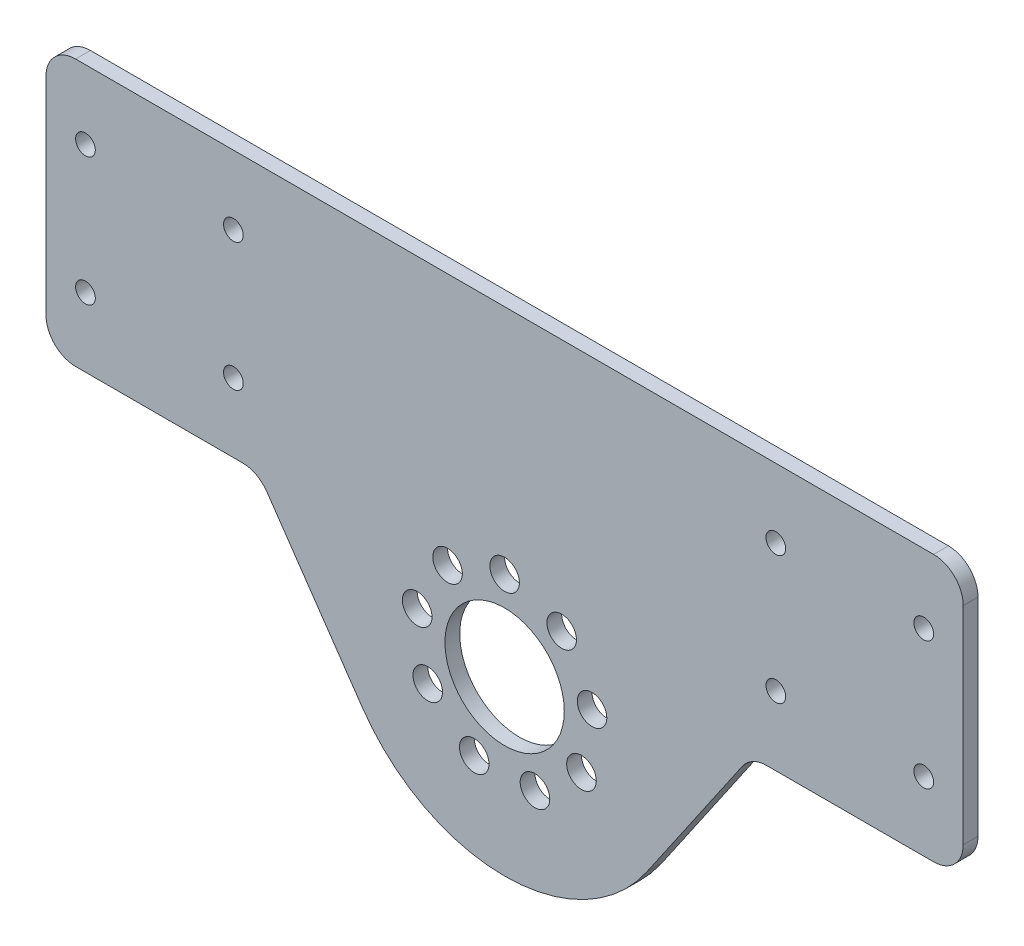
ISO-10303-21;
HEADER;
FILE_DESCRIPTION(('STEP AP214'),'2;1');
FILE_NAME('part.step','',(''),(''),'','','');
FILE_SCHEMA(('AUTOMOTIVE_DESIGN { 1 0 10303 214 1 1 1 1 }'));
ENDSEC;
DATA;
#1=APPLICATION_CONTEXT('core data for automotive mechanical design processes');
#2=APPLICATION_PROTOCOL_DEFINITION('international standard','automotive_design',2000,#1);
#3=PRODUCT_CONTEXT('',#1,'mechanical');
#4=PRODUCT('Part','Part','',(#3));
#5=PRODUCT_RELATED_PRODUCT_CATEGORY('part','',(#4));
#6=PRODUCT_DEFINITION_FORMATION('','',#4);
#7=PRODUCT_DEFINITION_CONTEXT('part definition',#1,'design');
#8=PRODUCT_DEFINITION('design','',#6,#7);
#9=PRODUCT_DEFINITION_SHAPE('','',#8);
#10=(LENGTH_UNIT() NAMED_UNIT(*) SI_UNIT(.MILLI.,.METRE.));
#11=(NAMED_UNIT(*) PLANE_ANGLE_UNIT() SI_UNIT($,.RADIAN.));
#12=(NAMED_UNIT(*) SI_UNIT($,.STERADIAN.) SOLID_ANGLE_UNIT());
#13=UNCERTAINTY_MEASURE_WITH_UNIT(LENGTH_MEASURE(1.E-05),#10,'distance_accuracy_value','');
#14=(GEOMETRIC_REPRESENTATION_CONTEXT(3) GLOBAL_UNCERTAINTY_ASSIGNED_CONTEXT((#13)) GLOBAL_UNIT_ASSIGNED_CONTEXT((#10,
#11,#12)) REPRESENTATION_CONTEXT('',''));
#15=CARTESIAN_POINT('',(0.,0.,0.));
#16=DIRECTION('',(0.,0.,1.));
#17=DIRECTION('',(1.,0.,0.));
#18=AXIS2_PLACEMENT_3D('',#15,#16,#17);
#19=CARTESIAN_POINT('',(-46.5,-27.,1.5));
#20=DIRECTION('',(0.,1.,0.));
#21=DIRECTION('',(-1.,0.,0.));
#22=AXIS2_PLACEMENT_3D('',#19,#20,#21);
#23=PLANE('',#22);
#24=DIRECTION('',(1.,0.,0.));
#25=VECTOR('',#24,1.);
#26=CARTESIAN_POINT('',(-46.5,-27.,1.5));
#27=LINE('',#26,#25);
#28=CARTESIAN_POINT('',(26.5796145769326,-27.,1.5));
#29=VERTEX_POINT('',#28);
#30=CARTESIAN_POINT('',(43.5,-27.,1.5));
#31=VERTEX_POINT('',#30);
#32=EDGE_CURVE('E221',#29,#31,#27,.T.);
#33=ORIENTED_EDGE('',*,*,#32,.F.);
#34=DIRECTION('',(0.,0.,1.));
#35=VECTOR('',#34,1.);
#36=CARTESIAN_POINT('',(26.5796145769327,-27.,1.5));
#37=LINE('',#36,#35);
#38=CARTESIAN_POINT('',(26.5796145769326,-27.,0.));
#39=VERTEX_POINT('',#38);
#40=EDGE_CURVE('E241',#29,#39,#37,.F.);
#41=ORIENTED_EDGE('',*,*,#40,.T.);
#42=DIRECTION('',(1.,0.,0.));
#43=VECTOR('',#42,1.);
#44=CARTESIAN_POINT('',(-46.5,-27.,0.));
#45=LINE('',#44,#43);
#46=CARTESIAN_POINT('',(43.5,-27.,0.));
#47=VERTEX_POINT('',#46);
#48=EDGE_CURVE('E236',#39,#47,#45,.T.);
#49=ORIENTED_EDGE('',*,*,#48,.T.);
#50=DIRECTION('',(0.,0.,-1.));
#51=VECTOR('',#50,1.);
#52=CARTESIAN_POINT('',(43.5,-27.,1.5));
#53=LINE('',#52,#51);
#54=EDGE_CURVE('E239',#47,#31,#53,.F.);
#55=ORIENTED_EDGE('',*,*,#54,.T.);
#56=EDGE_LOOP('',(#33,#41,#49,#55));
#57=FACE_BOUND('',#56,.T.);
#58=ADVANCED_FACE('F32',(#57),#23,.F.);
#59=CARTESIAN_POINT('',(0.,0.,1.5));
#60=DIRECTION('',(0.,0.,1.));
#61=DIRECTION('',(1.,0.,0.));
#62=AXIS2_PLACEMENT_3D('',#59,#60,#61);
#63=PLANE('',#62);
#64=CARTESIAN_POINT('',(-5.78508848717886,-25.6056000119292,1.5));
#65=DIRECTION('',(0.,0.,1.));
#66=DIRECTION('',(1.,0.,0.));
#67=AXIS2_PLACEMENT_3D('',#64,#65,#66);
#68=CIRCLE('',#67,1.5);
#69=CARTESIAN_POINT('',(-4.28508848717885,-25.6056000119292,1.5));
#70=VERTEX_POINT('',#69);
#71=EDGE_CURVE('E330',#70,#70,#68,.T.);
#72=ORIENTED_EDGE('',*,*,#71,.F.);
#73=EDGE_LOOP('',(#72));
#74=FACE_BOUND('',#73,.T.);
#75=CARTESIAN_POINT('',(-8.86326977710987,-30.9371664009976,1.5));
#76=DIRECTION('',(0.,0.,1.));
#77=DIRECTION('',(1.,0.,0.));
#78=AXIS2_PLACEMENT_3D('',#75,#76,#77);
#79=CIRCLE('',#78,1.5);
#80=CARTESIAN_POINT('',(-7.36326977710987,-30.9371664009976,1.5));
#81=VERTEX_POINT('',#80);
#82=EDGE_CURVE('E320',#81,#81,#79,.T.);
#83=ORIENTED_EDGE('',*,*,#82,.F.);
#84=EDGE_LOOP('',(#83));
#85=FACE_BOUND('',#84,.T.);
#86=CARTESIAN_POINT('',(-7.79422863405995,-37.,1.5));
#87=DIRECTION('',(0.,0.,1.));
#88=DIRECTION('',(1.,0.,0.));
#89=AXIS2_PLACEMENT_3D('',#86,#87,#88);
#90=CIRCLE('',#89,1.5);
#91=CARTESIAN_POINT('',(-6.29422863405995,-37.,1.5));
#92=VERTEX_POINT('',#91);
#93=EDGE_CURVE('E317',#92,#92,#90,.T.);
#94=ORIENTED_EDGE('',*,*,#93,.F.);
#95=EDGE_LOOP('',(#94));
#96=FACE_BOUND('',#95,.T.);
#97=CARTESIAN_POINT('',(-3.07818128993102,-40.9572335870732,1.5));
#98=DIRECTION('',(0.,0.,1.));
#99=DIRECTION('',(1.,0.,0.));
#100=AXIS2_PLACEMENT_3D('',#97,#98,#99);
#101=CIRCLE('',#100,1.5);
#102=CARTESIAN_POINT('',(-1.57818128993102,-40.9572335870732,1.5));
#103=VERTEX_POINT('',#102);
#104=EDGE_CURVE('E314',#103,#103,#101,.T.);
#105=ORIENTED_EDGE('',*,*,#104,.F.);
#106=EDGE_LOOP('',(#105));
#107=FACE_BOUND('',#106,.T.);
#108=CARTESIAN_POINT('',(3.07818128993102,-40.9572335870732,1.5));
#109=DIRECTION('',(0.,0.,1.));
#110=DIRECTION('',(1.,0.,0.));
#111=AXIS2_PLACEMENT_3D('',#108,#109,#110);
#112=CIRCLE('',#111,1.5);
#113=CARTESIAN_POINT('',(4.57818128993102,-40.9572335870732,1.5));
#114=VERTEX_POINT('',#113);
#115=EDGE_CURVE('E310',#114,#114,#112,.T.);
#116=ORIENTED_EDGE('',*,*,#115,.F.);
#117=EDGE_LOOP('',(#116));
#118=FACE_BOUND('',#117,.T.);
#119=CARTESIAN_POINT('',(7.79422863405995,-37.,1.5));
#120=DIRECTION('',(0.,0.,1.));
#121=DIRECTION('',(1.,0.,0.));
#122=AXIS2_PLACEMENT_3D('',#119,#120,#121);
#123=CIRCLE('',#122,1.5);
#124=CARTESIAN_POINT('',(9.29422863405995,-37.,1.5));
#125=VERTEX_POINT('',#124);
#126=EDGE_CURVE('E306',#125,#125,#123,.T.);
#127=ORIENTED_EDGE('',*,*,#126,.F.);
#128=EDGE_LOOP('',(#127));
#129=FACE_BOUND('',#128,.T.);
#130=CARTESIAN_POINT('',(8.86326977710987,-30.9371664009976,1.5));
#131=DIRECTION('',(0.,0.,1.));
#132=DIRECTION('',(1.,0.,0.));
#133=AXIS2_PLACEMENT_3D('',#130,#131,#132);
#134=CIRCLE('',#133,1.5);
#135=CARTESIAN_POINT('',(10.3632697771099,-30.9371664009976,1.5));
#136=VERTEX_POINT('',#135);
#137=EDGE_CURVE('E302',#136,#136,#134,.T.);
#138=ORIENTED_EDGE('',*,*,#137,.F.);
#139=EDGE_LOOP('',(#138));
#140=FACE_BOUND('',#139,.T.);
#141=CARTESIAN_POINT('',(5.78508848717885,-25.6056000119292,1.5));
#142=DIRECTION('',(0.,0.,1.));
#143=DIRECTION('',(1.,0.,0.));
#144=AXIS2_PLACEMENT_3D('',#141,#142,#143);
#145=CIRCLE('',#144,1.5);
#146=CARTESIAN_POINT('',(7.28508848717886,-25.6056000119292,1.5));
#147=VERTEX_POINT('',#146);
#148=EDGE_CURVE('E298',#147,#147,#145,.T.);
#149=ORIENTED_EDGE('',*,*,#148,.F.);
#150=EDGE_LOOP('',(#149));
#151=FACE_BOUND('',#150,.T.);
#152=CARTESIAN_POINT('',(0.,-23.5,1.5));
#153=DIRECTION('',(0.,0.,1.));
#154=DIRECTION('',(1.,0.,0.));
#155=AXIS2_PLACEMENT_3D('',#152,#153,#154);
#156=CIRCLE('',#155,1.5);
#157=CARTESIAN_POINT('',(1.5,-23.5,1.5));
#158=VERTEX_POINT('',#157);
#159=EDGE_CURVE('E294',#158,#158,#156,.T.);
#160=ORIENTED_EDGE('',*,*,#159,.F.);
#161=EDGE_LOOP('',(#160));
#162=FACE_BOUND('',#161,.T.);
#163=CARTESIAN_POINT('',(0.,-32.5,1.5));
#164=DIRECTION('',(0.,0.,1.));
#165=DIRECTION('',(1.,0.,0.));
#166=AXIS2_PLACEMENT_3D('',#163,#164,#165);
#167=CIRCLE('',#166,6.05);
#168=CARTESIAN_POINT('',(6.05,-32.5,1.5));
#169=VERTEX_POINT('',#168);
#170=EDGE_CURVE('E162',#169,#169,#167,.T.);
#171=ORIENTED_EDGE('',*,*,#170,.F.);
#172=EDGE_LOOP('',(#171));
#173=FACE_BOUND('',#172,.T.);
#174=CARTESIAN_POINT('',(-27.5,-20.,1.5));
#175=DIRECTION('',(0.,0.,1.));
#176=DIRECTION('',(-1.,0.,0.));
#177=AXIS2_PLACEMENT_3D('',#174,#175,#176);
#178=CIRCLE('',#177,1.);
#179=CARTESIAN_POINT('',(-28.5,-20.,1.5));
#180=VERTEX_POINT('',#179);
#181=EDGE_CURVE('E177',#180,#180,#178,.T.);
#182=ORIENTED_EDGE('',*,*,#181,.F.);
#183=EDGE_LOOP('',(#182));
#184=FACE_BOUND('',#183,.T.);
#185=CARTESIAN_POINT('',(-42.5,-7.,1.5));
#186=DIRECTION('',(0.,0.,1.));
#187=DIRECTION('',(-1.,0.,0.));
#188=AXIS2_PLACEMENT_3D('',#185,#186,#187);
#189=CIRCLE('',#188,0.999999999999998);
#190=CARTESIAN_POINT('',(-43.5,-7.,1.5));
#191=VERTEX_POINT('',#190);
#192=EDGE_CURVE('E189',#191,#191,#189,.T.);
#193=ORIENTED_EDGE('',*,*,#192,.F.);
#194=EDGE_LOOP('',(#193));
#195=FACE_BOUND('',#194,.T.);
#196=CARTESIAN_POINT('',(42.5,-20.,1.5));
#197=DIRECTION('',(0.,0.,1.));
#198=DIRECTION('',(-1.,0.,0.));
#199=AXIS2_PLACEMENT_3D('',#196,#197,#198);
#200=CIRCLE('',#199,0.999999999999998);
#201=CARTESIAN_POINT('',(41.5,-20.,1.5));
#202=VERTEX_POINT('',#201);
#203=EDGE_CURVE('E201',#202,#202,#200,.T.);
#204=ORIENTED_EDGE('',*,*,#203,.F.);
#205=EDGE_LOOP('',(#204));
#206=FACE_BOUND('',#205,.T.);
#207=CARTESIAN_POINT('',(42.5,-7.,1.5));
#208=DIRECTION('',(0.,0.,1.));
#209=DIRECTION('',(1.,0.,0.));
#210=AXIS2_PLACEMENT_3D('',#207,#208,#209);
#211=CIRCLE('',#210,0.999999999999998);
#212=CARTESIAN_POINT('',(43.5,-7.,1.5));
#213=VERTEX_POINT('',#212);
#214=EDGE_CURVE('E213',#213,#213,#211,.T.);
#215=ORIENTED_EDGE('',*,*,#214,.F.);
#216=EDGE_LOOP('',(#215));
#217=FACE_BOUND('',#216,.T.);
#218=DIRECTION('',(0.,1.,0.));
#219=VECTOR('',#218,1.);
#220=CARTESIAN_POINT('',(46.5,0.,1.5));
#221=LINE('',#220,#219);
#222=CARTESIAN_POINT('',(46.5,-24.,1.5));
#223=VERTEX_POINT('',#222);
#224=CARTESIAN_POINT('',(46.5,-3.,1.5));
#225=VERTEX_POINT('',#224);
#226=EDGE_CURVE('E225',#223,#225,#221,.T.);
#227=ORIENTED_EDGE('',*,*,#226,.T.);
#228=CARTESIAN_POINT('',(43.5,-3.,1.5));
#229=DIRECTION('',(0.,0.,1.));
#230=DIRECTION('',(1.,0.,0.));
#231=AXIS2_PLACEMENT_3D('',#228,#229,#230);
#232=CIRCLE('',#231,3.);
#233=CARTESIAN_POINT('',(43.5,0.,1.5));
#234=VERTEX_POINT('',#233);
#235=EDGE_CURVE('E455',#225,#234,#232,.T.);
#236=ORIENTED_EDGE('',*,*,#235,.T.);
#237=DIRECTION('',(-1.,0.,0.));
#238=VECTOR('',#237,1.);
#239=CARTESIAN_POINT('',(-46.5,0.,1.5));
#240=LINE('',#239,#238);
#241=CARTESIAN_POINT('',(-43.5,0.,1.5));
#242=VERTEX_POINT('',#241);
#243=EDGE_CURVE('E263',#234,#242,#240,.T.);
#244=ORIENTED_EDGE('',*,*,#243,.T.);
#245=CARTESIAN_POINT('',(-43.5,-3.,1.5));
#246=DIRECTION('',(0.,0.,1.));
#247=DIRECTION('',(1.,0.,0.));
#248=AXIS2_PLACEMENT_3D('',#245,#246,#247);
#249=CIRCLE('',#248,3.);
#250=CARTESIAN_POINT('',(-46.5,-3.,1.5));
#251=VERTEX_POINT('',#250);
#252=EDGE_CURVE('E54',#242,#251,#249,.T.);
#253=ORIENTED_EDGE('',*,*,#252,.T.);
#254=DIRECTION('',(0.,-1.,0.));
#255=VECTOR('',#254,1.);
#256=CARTESIAN_POINT('',(-46.5,0.,1.5));
#257=LINE('',#256,#255);
#258=CARTESIAN_POINT('',(-46.5,-24.,1.5));
#259=VERTEX_POINT('',#258);
#260=EDGE_CURVE('E219',#251,#259,#257,.T.);
#261=ORIENTED_EDGE('',*,*,#260,.T.);
#262=CARTESIAN_POINT('',(-43.5,-24.,1.5));
#263=DIRECTION('',(0.,0.,1.));
#264=DIRECTION('',(1.,0.,0.));
#265=AXIS2_PLACEMENT_3D('',#262,#263,#264);
#266=CIRCLE('',#265,3.);
#267=CARTESIAN_POINT('',(-43.5,-27.,1.5));
#268=VERTEX_POINT('',#267);
#269=EDGE_CURVE('E270',#259,#268,#266,.T.);
#270=ORIENTED_EDGE('',*,*,#269,.T.);
#271=CARTESIAN_POINT('',(-26.5796145769327,-27.,1.5));
#272=VERTEX_POINT('',#271);
#273=EDGE_CURVE('E229',#268,#272,#27,.T.);
#274=ORIENTED_EDGE('',*,*,#273,.T.);
#275=CARTESIAN_POINT('',(-26.5796145769327,-30.,1.5));
#276=DIRECTION('',(0.,0.,1.));
#277=DIRECTION('',(1.,0.,0.));
#278=AXIS2_PLACEMENT_3D('',#275,#276,#277);
#279=CIRCLE('',#278,3.);
#280=CARTESIAN_POINT('',(-24.106138135998,-28.3023798139333,1.5));
#281=VERTEX_POINT('',#280);
#282=EDGE_CURVE('E40',#272,#281,#279,.F.);
#283=ORIENTED_EDGE('',*,*,#282,.T.);
#284=DIRECTION('',(0.565873395355567,-0.824492146978225,0.));
#285=VECTOR('',#284,1.);
#286=CARTESIAN_POINT('',(-14.4286125721189,-42.4027844187224,1.5));
#287=LINE('',#286,#285);
#288=CARTESIAN_POINT('',(-14.4286125721189,-42.4027844187224,1.5));
#289=VERTEX_POINT('',#288);
#290=EDGE_CURVE('E145',#281,#289,#287,.T.);
#291=ORIENTED_EDGE('',*,*,#290,.T.);
#292=CARTESIAN_POINT('',(0.,-32.5,1.5));
#293=DIRECTION('',(0.,0.,1.));
#294=DIRECTION('',(1.,0.,0.));
#295=AXIS2_PLACEMENT_3D('',#292,#293,#294);
#296=CIRCLE('',#295,17.5);
#297=CARTESIAN_POINT('',(14.4286125721189,-42.4027844187224,1.5));
#298=VERTEX_POINT('',#297);
#299=EDGE_CURVE('E140',#289,#298,#296,.T.);
#300=ORIENTED_EDGE('',*,*,#299,.T.);
#301=DIRECTION('',(0.565873395355567,0.824492146978225,0.));
#302=VECTOR('',#301,1.);
#303=CARTESIAN_POINT('',(14.4286125721189,-42.4027844187224,1.5));
#304=LINE('',#303,#302);
#305=CARTESIAN_POINT('',(24.106138135998,-28.3023798139333,1.5));
#306=VERTEX_POINT('',#305);
#307=EDGE_CURVE('E149',#298,#306,#304,.T.);
#308=ORIENTED_EDGE('',*,*,#307,.T.);
#309=CARTESIAN_POINT('',(26.5796145769327,-30.,1.5));
#310=DIRECTION('',(0.,0.,1.));
#311=DIRECTION('',(1.,0.,0.));
#312=AXIS2_PLACEMENT_3D('',#309,#310,#311);
#313=CIRCLE('',#312,3.);
#314=EDGE_CURVE('E459',#306,#29,#313,.F.);
#315=ORIENTED_EDGE('',*,*,#314,.T.);
#316=ORIENTED_EDGE('',*,*,#32,.T.);
#317=CARTESIAN_POINT('',(43.5,-24.,1.5));
#318=DIRECTION('',(0.,0.,1.));
#319=DIRECTION('',(1.,0.,0.));
#320=AXIS2_PLACEMENT_3D('',#317,#318,#319);
#321=CIRCLE('',#320,3.);
#322=EDGE_CURVE('E448',#31,#223,#321,.T.);
#323=ORIENTED_EDGE('',*,*,#322,.T.);
#324=EDGE_LOOP('',(#227,#236,#244,#253,#261,#270,#274,#283,#291,#300,#308,#315,#316,#323));
#325=FACE_BOUND('',#324,.T.);
#326=CARTESIAN_POINT('',(27.5,-7.,1.5));
#327=DIRECTION('',(0.,0.,1.));
#328=DIRECTION('',(-1.,0.,0.));
#329=AXIS2_PLACEMENT_3D('',#326,#327,#328);
#330=CIRCLE('',#329,1.);
#331=CARTESIAN_POINT('',(26.5,-7.,1.5));
#332=VERTEX_POINT('',#331);
#333=EDGE_CURVE('E207',#332,#332,#330,.T.);
#334=ORIENTED_EDGE('',*,*,#333,.F.);
#335=EDGE_LOOP('',(#334));
#336=FACE_BOUND('',#335,.T.);
#337=CARTESIAN_POINT('',(27.5,-20.,1.5));
#338=DIRECTION('',(0.,0.,1.));
#339=DIRECTION('',(1.,0.,0.));
#340=AXIS2_PLACEMENT_3D('',#337,#338,#339);
#341=CIRCLE('',#340,1.);
#342=CARTESIAN_POINT('',(28.5,-20.,1.5));
#343=VERTEX_POINT('',#342);
#344=EDGE_CURVE('E195',#343,#343,#341,.T.);
#345=ORIENTED_EDGE('',*,*,#344,.F.);
#346=EDGE_LOOP('',(#345));
#347=FACE_BOUND('',#346,.T.);
#348=CARTESIAN_POINT('',(-42.5,-20.,1.5));
#349=DIRECTION('',(0.,0.,1.));
#350=DIRECTION('',(1.,0.,0.));
#351=AXIS2_PLACEMENT_3D('',#348,#349,#350);
#352=CIRCLE('',#351,0.999999999999998);
#353=CARTESIAN_POINT('',(-41.5,-20.,1.5));
#354=VERTEX_POINT('',#353);
#355=EDGE_CURVE('E183',#354,#354,#352,.T.);
#356=ORIENTED_EDGE('',*,*,#355,.F.);
#357=EDGE_LOOP('',(#356));
#358=FACE_BOUND('',#357,.T.);
#359=CARTESIAN_POINT('',(-27.5,-6.99999999999999,1.5));
#360=DIRECTION('',(0.,0.,1.));
#361=DIRECTION('',(1.,0.,0.));
#362=AXIS2_PLACEMENT_3D('',#359,#360,#361);
#363=CIRCLE('',#362,1.);
#364=CARTESIAN_POINT('',(-26.5,-6.99999999999999,1.5));
#365=VERTEX_POINT('',#364);
#366=EDGE_CURVE('E169',#365,#365,#363,.T.);
#367=ORIENTED_EDGE('',*,*,#366,.F.);
#368=EDGE_LOOP('',(#367));
#369=FACE_BOUND('',#368,.T.);
#370=ADVANCED_FACE('F155',(#74,#85,#96,#107,#118,#129,#140,#151,#162,#173,#184,#195,#206,#217,
#325,#336,#347,#358,#369),#63,.T.);
#371=CARTESIAN_POINT('',(0.,0.,0.));
#372=DIRECTION('',(0.,0.,1.));
#373=DIRECTION('',(1.,0.,0.));
#374=AXIS2_PLACEMENT_3D('',#371,#372,#373);
#375=PLANE('',#374);
#376=CARTESIAN_POINT('',(-5.78508848717886,-25.6056000119292,0.));
#377=DIRECTION('',(0.,0.,1.));
#378=DIRECTION('',(1.,0.,0.));
#379=AXIS2_PLACEMENT_3D('',#376,#377,#378);
#380=CIRCLE('',#379,1.5);
#381=CARTESIAN_POINT('',(-4.28508848717885,-25.6056000119292,0.));
#382=VERTEX_POINT('',#381);
#383=EDGE_CURVE('E261',#382,#382,#380,.T.);
#384=ORIENTED_EDGE('',*,*,#383,.T.);
#385=EDGE_LOOP('',(#384));
#386=FACE_BOUND('',#385,.T.);
#387=CARTESIAN_POINT('',(-8.86326977710987,-30.9371664009976,0.));
#388=DIRECTION('',(0.,0.,1.));
#389=DIRECTION('',(1.,0.,0.));
#390=AXIS2_PLACEMENT_3D('',#387,#388,#389);
#391=CIRCLE('',#390,1.5);
#392=CARTESIAN_POINT('',(-7.36326977710987,-30.9371664009976,0.));
#393=VERTEX_POINT('',#392);
#394=EDGE_CURVE('E318',#393,#393,#391,.T.);
#395=ORIENTED_EDGE('',*,*,#394,.T.);
#396=EDGE_LOOP('',(#395));
#397=FACE_BOUND('',#396,.T.);
#398=CARTESIAN_POINT('',(-7.79422863405995,-37.,0.));
#399=DIRECTION('',(0.,0.,1.));
#400=DIRECTION('',(1.,0.,0.));
#401=AXIS2_PLACEMENT_3D('',#398,#399,#400);
#402=CIRCLE('',#401,1.5);
#403=CARTESIAN_POINT('',(-6.29422863405995,-37.,0.));
#404=VERTEX_POINT('',#403);
#405=EDGE_CURVE('E315',#404,#404,#402,.T.);
#406=ORIENTED_EDGE('',*,*,#405,.T.);
#407=EDGE_LOOP('',(#406));
#408=FACE_BOUND('',#407,.T.);
#409=CARTESIAN_POINT('',(-3.07818128993102,-40.9572335870732,0.));
#410=DIRECTION('',(0.,0.,1.));
#411=DIRECTION('',(1.,0.,0.));
#412=AXIS2_PLACEMENT_3D('',#409,#410,#411);
#413=CIRCLE('',#412,1.5);
#414=CARTESIAN_POINT('',(-1.57818128993102,-40.9572335870732,0.));
#415=VERTEX_POINT('',#414);
#416=EDGE_CURVE('E311',#415,#415,#413,.T.);
#417=ORIENTED_EDGE('',*,*,#416,.T.);
#418=EDGE_LOOP('',(#417));
#419=FACE_BOUND('',#418,.T.);
#420=CARTESIAN_POINT('',(3.07818128993102,-40.9572335870732,0.));
#421=DIRECTION('',(0.,0.,1.));
#422=DIRECTION('',(1.,0.,0.));
#423=AXIS2_PLACEMENT_3D('',#420,#421,#422);
#424=CIRCLE('',#423,1.5);
#425=CARTESIAN_POINT('',(4.57818128993102,-40.9572335870732,0.));
#426=VERTEX_POINT('',#425);
#427=EDGE_CURVE('E307',#426,#426,#424,.T.);
#428=ORIENTED_EDGE('',*,*,#427,.T.);
#429=EDGE_LOOP('',(#428));
#430=FACE_BOUND('',#429,.T.);
#431=CARTESIAN_POINT('',(7.79422863405995,-37.,0.));
#432=DIRECTION('',(0.,0.,1.));
#433=DIRECTION('',(1.,0.,0.));
#434=AXIS2_PLACEMENT_3D('',#431,#432,#433);
#435=CIRCLE('',#434,1.5);
#436=CARTESIAN_POINT('',(9.29422863405995,-37.,0.));
#437=VERTEX_POINT('',#436);
#438=EDGE_CURVE('E303',#437,#437,#435,.T.);
#439=ORIENTED_EDGE('',*,*,#438,.T.);
#440=EDGE_LOOP('',(#439));
#441=FACE_BOUND('',#440,.T.);
#442=CARTESIAN_POINT('',(8.86326977710987,-30.9371664009976,0.));
#443=DIRECTION('',(0.,0.,1.));
#444=DIRECTION('',(1.,0.,0.));
#445=AXIS2_PLACEMENT_3D('',#442,#443,#444);
#446=CIRCLE('',#445,1.5);
#447=CARTESIAN_POINT('',(10.3632697771099,-30.9371664009976,0.));
#448=VERTEX_POINT('',#447);
#449=EDGE_CURVE('E299',#448,#448,#446,.T.);
#450=ORIENTED_EDGE('',*,*,#449,.T.);
#451=EDGE_LOOP('',(#450));
#452=FACE_BOUND('',#451,.T.);
#453=CARTESIAN_POINT('',(5.78508848717885,-25.6056000119292,0.));
#454=DIRECTION('',(0.,0.,1.));
#455=DIRECTION('',(1.,0.,0.));
#456=AXIS2_PLACEMENT_3D('',#453,#454,#455);
#457=CIRCLE('',#456,1.5);
#458=CARTESIAN_POINT('',(7.28508848717886,-25.6056000119292,0.));
#459=VERTEX_POINT('',#458);
#460=EDGE_CURVE('E295',#459,#459,#457,.T.);
#461=ORIENTED_EDGE('',*,*,#460,.T.);
#462=EDGE_LOOP('',(#461));
#463=FACE_BOUND('',#462,.T.);
#464=CARTESIAN_POINT('',(0.,-23.5,0.));
#465=DIRECTION('',(0.,0.,1.));
#466=DIRECTION('',(1.,0.,0.));
#467=AXIS2_PLACEMENT_3D('',#464,#465,#466);
#468=CIRCLE('',#467,1.5);
#469=CARTESIAN_POINT('',(1.5,-23.5,0.));
#470=VERTEX_POINT('',#469);
#471=EDGE_CURVE('E291',#470,#470,#468,.T.);
#472=ORIENTED_EDGE('',*,*,#471,.T.);
#473=EDGE_LOOP('',(#472));
#474=FACE_BOUND('',#473,.T.);
#475=CARTESIAN_POINT('',(0.,-32.5,0.));
#476=DIRECTION('',(0.,0.,1.));
#477=DIRECTION('',(1.,0.,0.));
#478=AXIS2_PLACEMENT_3D('',#475,#476,#477);
#479=CIRCLE('',#478,6.05);
#480=CARTESIAN_POINT('',(6.05,-32.5,0.));
#481=VERTEX_POINT('',#480);
#482=EDGE_CURVE('E159',#481,#481,#479,.T.);
#483=ORIENTED_EDGE('',*,*,#482,.T.);
#484=EDGE_LOOP('',(#483));
#485=FACE_BOUND('',#484,.T.);
#486=CARTESIAN_POINT('',(-27.5,-20.,0.));
#487=DIRECTION('',(0.,0.,1.));
#488=DIRECTION('',(-1.,0.,0.));
#489=AXIS2_PLACEMENT_3D('',#486,#487,#488);
#490=CIRCLE('',#489,1.);
#491=CARTESIAN_POINT('',(-28.5,-20.,0.));
#492=VERTEX_POINT('',#491);
#493=EDGE_CURVE('E172',#492,#492,#490,.T.);
#494=ORIENTED_EDGE('',*,*,#493,.T.);
#495=EDGE_LOOP('',(#494));
#496=FACE_BOUND('',#495,.T.);
#497=CARTESIAN_POINT('',(-42.5,-7.,0.));
#498=DIRECTION('',(0.,0.,1.));
#499=DIRECTION('',(-1.,0.,0.));
#500=AXIS2_PLACEMENT_3D('',#497,#498,#499);
#501=CIRCLE('',#500,0.999999999999998);
#502=CARTESIAN_POINT('',(-43.5,-7.,0.));
#503=VERTEX_POINT('',#502);
#504=EDGE_CURVE('E186',#503,#503,#501,.T.);
#505=ORIENTED_EDGE('',*,*,#504,.T.);
#506=EDGE_LOOP('',(#505));
#507=FACE_BOUND('',#506,.T.);
#508=CARTESIAN_POINT('',(42.5,-20.,0.));
#509=DIRECTION('',(0.,0.,1.));
#510=DIRECTION('',(-1.,0.,0.));
#511=AXIS2_PLACEMENT_3D('',#508,#509,#510);
#512=CIRCLE('',#511,0.999999999999998);
#513=CARTESIAN_POINT('',(41.5,-20.,0.));
#514=VERTEX_POINT('',#513);
#515=EDGE_CURVE('E198',#514,#514,#512,.T.);
#516=ORIENTED_EDGE('',*,*,#515,.T.);
#517=EDGE_LOOP('',(#516));
#518=FACE_BOUND('',#517,.T.);
#519=CARTESIAN_POINT('',(42.5,-7.,0.));
#520=DIRECTION('',(0.,0.,1.));
#521=DIRECTION('',(1.,0.,0.));
#522=AXIS2_PLACEMENT_3D('',#519,#520,#521);
#523=CIRCLE('',#522,0.999999999999998);
#524=CARTESIAN_POINT('',(43.5,-7.,0.));
#525=VERTEX_POINT('',#524);
#526=EDGE_CURVE('E210',#525,#525,#523,.T.);
#527=ORIENTED_EDGE('',*,*,#526,.T.);
#528=EDGE_LOOP('',(#527));
#529=FACE_BOUND('',#528,.T.);
#530=DIRECTION('',(-1.,0.,0.));
#531=VECTOR('',#530,1.);
#532=CARTESIAN_POINT('',(-46.5,0.,0.));
#533=LINE('',#532,#531);
#534=CARTESIAN_POINT('',(43.5,0.,0.));
#535=VERTEX_POINT('',#534);
#536=CARTESIAN_POINT('',(-43.5,0.,0.));
#537=VERTEX_POINT('',#536);
#538=EDGE_CURVE('E222',#535,#537,#533,.T.);
#539=ORIENTED_EDGE('',*,*,#538,.F.);
#540=CARTESIAN_POINT('',(43.5,-3.,0.));
#541=DIRECTION('',(0.,0.,1.));
#542=DIRECTION('',(1.,0.,0.));
#543=AXIS2_PLACEMENT_3D('',#540,#541,#542);
#544=CIRCLE('',#543,3.);
#545=CARTESIAN_POINT('',(46.5,-3.,0.));
#546=VERTEX_POINT('',#545);
#547=EDGE_CURVE('E474',#535,#546,#544,.F.);
#548=ORIENTED_EDGE('',*,*,#547,.T.);
#549=DIRECTION('',(0.,1.,0.));
#550=VECTOR('',#549,1.);
#551=CARTESIAN_POINT('',(46.5,0.,0.));
#552=LINE('',#551,#550);
#553=CARTESIAN_POINT('',(46.5,-24.,0.));
#554=VERTEX_POINT('',#553);
#555=EDGE_CURVE('E245',#554,#546,#552,.T.);
#556=ORIENTED_EDGE('',*,*,#555,.F.);
#557=CARTESIAN_POINT('',(43.5,-24.,0.));
#558=DIRECTION('',(0.,0.,1.));
#559=DIRECTION('',(1.,0.,0.));
#560=AXIS2_PLACEMENT_3D('',#557,#558,#559);
#561=CIRCLE('',#560,3.);
#562=EDGE_CURVE('E469',#554,#47,#561,.F.);
#563=ORIENTED_EDGE('',*,*,#562,.T.);
#564=ORIENTED_EDGE('',*,*,#48,.F.);
#565=CARTESIAN_POINT('',(26.5796145769327,-30.,0.));
#566=DIRECTION('',(0.,0.,1.));
#567=DIRECTION('',(1.,0.,0.));
#568=AXIS2_PLACEMENT_3D('',#565,#566,#567);
#569=CIRCLE('',#568,3.);
#570=CARTESIAN_POINT('',(24.106138135998,-28.3023798139333,0.));
#571=VERTEX_POINT('',#570);
#572=EDGE_CURVE('E461',#39,#571,#569,.T.);
#573=ORIENTED_EDGE('',*,*,#572,.T.);
#574=DIRECTION('',(-0.565873395355567,-0.824492146978225,0.));
#575=VECTOR('',#574,1.);
#576=CARTESIAN_POINT('',(14.4286125721189,-42.4027844187224,0.));
#577=LINE('',#576,#575);
#578=CARTESIAN_POINT('',(14.4286125721189,-42.4027844187224,0.));
#579=VERTEX_POINT('',#578);
#580=EDGE_CURVE('E176',#571,#579,#577,.T.);
#581=ORIENTED_EDGE('',*,*,#580,.T.);
#582=CARTESIAN_POINT('',(0.,-32.5,0.));
#583=DIRECTION('',(0.,0.,1.));
#584=DIRECTION('',(1.,0.,0.));
#585=AXIS2_PLACEMENT_3D('',#582,#583,#584);
#586=CIRCLE('',#585,17.5);
#587=CARTESIAN_POINT('',(-14.4286125721189,-42.4027844187224,0.));
#588=VERTEX_POINT('',#587);
#589=EDGE_CURVE('E141',#579,#588,#586,.F.);
#590=ORIENTED_EDGE('',*,*,#589,.T.);
#591=DIRECTION('',(-0.565873395355567,0.824492146978225,0.));
#592=VECTOR('',#591,1.);
#593=CARTESIAN_POINT('',(-14.4286125721189,-42.4027844187224,0.));
#594=LINE('',#593,#592);
#595=CARTESIAN_POINT('',(-24.106138135998,-28.3023798139333,0.));
#596=VERTEX_POINT('',#595);
#597=EDGE_CURVE('E167',#588,#596,#594,.T.);
#598=ORIENTED_EDGE('',*,*,#597,.T.);
#599=CARTESIAN_POINT('',(-26.5796145769327,-30.,0.));
#600=DIRECTION('',(0.,0.,1.));
#601=DIRECTION('',(1.,0.,0.));
#602=AXIS2_PLACEMENT_3D('',#599,#600,#601);
#603=CIRCLE('',#602,3.);
#604=CARTESIAN_POINT('',(-26.5796145769327,-27.,0.));
#605=VERTEX_POINT('',#604);
#606=EDGE_CURVE('E11',#596,#605,#603,.T.);
#607=ORIENTED_EDGE('',*,*,#606,.T.);
#608=CARTESIAN_POINT('',(-43.5,-27.,0.));
#609=VERTEX_POINT('',#608);
#610=EDGE_CURVE('E243',#609,#605,#45,.T.);
#611=ORIENTED_EDGE('',*,*,#610,.F.);
#612=CARTESIAN_POINT('',(-43.5,-24.,0.));
#613=DIRECTION('',(0.,0.,1.));
#614=DIRECTION('',(1.,0.,0.));
#615=AXIS2_PLACEMENT_3D('',#612,#613,#614);
#616=CIRCLE('',#615,3.);
#617=CARTESIAN_POINT('',(-46.5,-24.,0.));
#618=VERTEX_POINT('',#617);
#619=EDGE_CURVE('E281',#609,#618,#616,.F.);
#620=ORIENTED_EDGE('',*,*,#619,.T.);
#621=DIRECTION('',(0.,-1.,0.));
#622=VECTOR('',#621,1.);
#623=CARTESIAN_POINT('',(-46.5,0.,0.));
#624=LINE('',#623,#622);
#625=CARTESIAN_POINT('',(-46.5,-3.,0.));
#626=VERTEX_POINT('',#625);
#627=EDGE_CURVE('E216',#626,#618,#624,.T.);
#628=ORIENTED_EDGE('',*,*,#627,.F.);
#629=CARTESIAN_POINT('',(-43.5,-3.,0.));
#630=DIRECTION('',(0.,0.,1.));
#631=DIRECTION('',(1.,0.,0.));
#632=AXIS2_PLACEMENT_3D('',#629,#630,#631);
#633=CIRCLE('',#632,3.);
#634=EDGE_CURVE('E478',#626,#537,#633,.F.);
#635=ORIENTED_EDGE('',*,*,#634,.T.);
#636=EDGE_LOOP('',(#539,#548,#556,#563,#564,#573,#581,#590,#598,#607,#611,#620,#628,#635));
#637=FACE_BOUND('',#636,.T.);
#638=CARTESIAN_POINT('',(27.5,-7.,0.));
#639=DIRECTION('',(0.,0.,1.));
#640=DIRECTION('',(-1.,0.,0.));
#641=AXIS2_PLACEMENT_3D('',#638,#639,#640);
#642=CIRCLE('',#641,1.);
#643=CARTESIAN_POINT('',(26.5,-7.,0.));
#644=VERTEX_POINT('',#643);
#645=EDGE_CURVE('E204',#644,#644,#642,.T.);
#646=ORIENTED_EDGE('',*,*,#645,.T.);
#647=EDGE_LOOP('',(#646));
#648=FACE_BOUND('',#647,.T.);
#649=CARTESIAN_POINT('',(27.5,-20.,0.));
#650=DIRECTION('',(0.,0.,1.));
#651=DIRECTION('',(1.,0.,0.));
#652=AXIS2_PLACEMENT_3D('',#649,#650,#651);
#653=CIRCLE('',#652,1.);
#654=CARTESIAN_POINT('',(28.5,-20.,0.));
#655=VERTEX_POINT('',#654);
#656=EDGE_CURVE('E192',#655,#655,#653,.T.);
#657=ORIENTED_EDGE('',*,*,#656,.T.);
#658=EDGE_LOOP('',(#657));
#659=FACE_BOUND('',#658,.T.);
#660=CARTESIAN_POINT('',(-42.5,-20.,0.));
#661=DIRECTION('',(0.,0.,1.));
#662=DIRECTION('',(1.,0.,0.));
#663=AXIS2_PLACEMENT_3D('',#660,#661,#662);
#664=CIRCLE('',#663,0.999999999999998);
#665=CARTESIAN_POINT('',(-41.5,-20.,0.));
#666=VERTEX_POINT('',#665);
#667=EDGE_CURVE('E180',#666,#666,#664,.T.);
#668=ORIENTED_EDGE('',*,*,#667,.T.);
#669=EDGE_LOOP('',(#668));
#670=FACE_BOUND('',#669,.T.);
#671=CARTESIAN_POINT('',(-27.5,-6.99999999999999,0.));
#672=DIRECTION('',(0.,0.,1.));
#673=DIRECTION('',(1.,0.,0.));
#674=AXIS2_PLACEMENT_3D('',#671,#672,#673);
#675=CIRCLE('',#674,1.);
#676=CARTESIAN_POINT('',(-26.5,-6.99999999999999,0.));
#677=VERTEX_POINT('',#676);
#678=EDGE_CURVE('E173',#677,#677,#675,.T.);
#679=ORIENTED_EDGE('',*,*,#678,.T.);
#680=EDGE_LOOP('',(#679));
#681=FACE_BOUND('',#680,.T.);
#682=ADVANCED_FACE('F352',(#386,#397,#408,#419,#430,#441,#452,#463,#474,#485,#496,#507,#518,
#529,#637,#648,#659,#670,#681),#375,.F.);
#683=CARTESIAN_POINT('',(-46.5,0.,1.5));
#684=DIRECTION('',(1.,0.,0.));
#685=DIRECTION('',(0.,0.,-1.));
#686=AXIS2_PLACEMENT_3D('',#683,#684,#685);
#687=PLANE('',#686);
#688=ORIENTED_EDGE('',*,*,#627,.T.);
#689=DIRECTION('',(0.,0.,-1.));
#690=VECTOR('',#689,1.);
#691=CARTESIAN_POINT('',(-46.5,-24.,1.5));
#692=LINE('',#691,#690);
#693=EDGE_CURVE('E47',#618,#259,#692,.F.);
#694=ORIENTED_EDGE('',*,*,#693,.T.);
#695=ORIENTED_EDGE('',*,*,#260,.F.);
#696=DIRECTION('',(0.,0.,-1.));
#697=VECTOR('',#696,1.);
#698=CARTESIAN_POINT('',(-46.5,-3.,1.5));
#699=LINE('',#698,#697);
#700=EDGE_CURVE('E445',#251,#626,#699,.T.);
#701=ORIENTED_EDGE('',*,*,#700,.T.);
#702=EDGE_LOOP('',(#688,#694,#695,#701));
#703=FACE_BOUND('',#702,.T.);
#704=ADVANCED_FACE('F373',(#703),#687,.F.);
#705=ORIENTED_EDGE('',*,*,#610,.T.);
#706=DIRECTION('',(0.,0.,1.));
#707=VECTOR('',#706,1.);
#708=CARTESIAN_POINT('',(-26.5796145769327,-27.,1.5));
#709=LINE('',#708,#707);
#710=EDGE_CURVE('E278',#605,#272,#709,.T.);
#711=ORIENTED_EDGE('',*,*,#710,.T.);
#712=ORIENTED_EDGE('',*,*,#273,.F.);
#713=DIRECTION('',(0.,0.,-1.));
#714=VECTOR('',#713,1.);
#715=CARTESIAN_POINT('',(-43.5,-27.,1.5));
#716=LINE('',#715,#714);
#717=EDGE_CURVE('E242',#268,#609,#716,.T.);
#718=ORIENTED_EDGE('',*,*,#717,.T.);
#719=EDGE_LOOP('',(#705,#711,#712,#718));
#720=FACE_BOUND('',#719,.T.);
#721=ADVANCED_FACE('F275',(#720),#23,.F.);
#722=CARTESIAN_POINT('',(46.5,0.,1.5));
#723=DIRECTION('',(-1.,0.,0.));
#724=DIRECTION('',(0.,0.,1.));
#725=AXIS2_PLACEMENT_3D('',#722,#723,#724);
#726=PLANE('',#725);
#727=ORIENTED_EDGE('',*,*,#555,.T.);
#728=DIRECTION('',(0.,0.,-1.));
#729=VECTOR('',#728,1.);
#730=CARTESIAN_POINT('',(46.5,-3.,1.5));
#731=LINE('',#730,#729);
#732=EDGE_CURVE('E446',#546,#225,#731,.F.);
#733=ORIENTED_EDGE('',*,*,#732,.T.);
#734=ORIENTED_EDGE('',*,*,#226,.F.);
#735=DIRECTION('',(0.,0.,-1.));
#736=VECTOR('',#735,1.);
#737=CARTESIAN_POINT('',(46.5,-24.,1.5));
#738=LINE('',#737,#736);
#739=EDGE_CURVE('E450',#223,#554,#738,.T.);
#740=ORIENTED_EDGE('',*,*,#739,.T.);
#741=EDGE_LOOP('',(#727,#733,#734,#740));
#742=FACE_BOUND('',#741,.T.);
#743=ADVANCED_FACE('F409',(#742),#726,.F.);
#744=CARTESIAN_POINT('',(-46.5,0.,1.5));
#745=DIRECTION('',(0.,-1.,0.));
#746=DIRECTION('',(0.,0.,-1.));
#747=AXIS2_PLACEMENT_3D('',#744,#745,#746);
#748=PLANE('',#747);
#749=ORIENTED_EDGE('',*,*,#243,.F.);
#750=DIRECTION('',(0.,0.,-1.));
#751=VECTOR('',#750,1.);
#752=CARTESIAN_POINT('',(43.5,0.,1.5));
#753=LINE('',#752,#751);
#754=EDGE_CURVE('E476',#234,#535,#753,.T.);
#755=ORIENTED_EDGE('',*,*,#754,.T.);
#756=ORIENTED_EDGE('',*,*,#538,.T.);
#757=DIRECTION('',(0.,0.,-1.));
#758=VECTOR('',#757,1.);
#759=CARTESIAN_POINT('',(-43.5,0.,1.5));
#760=LINE('',#759,#758);
#761=EDGE_CURVE('E443',#537,#242,#760,.F.);
#762=ORIENTED_EDGE('',*,*,#761,.T.);
#763=EDGE_LOOP('',(#749,#755,#756,#762));
#764=FACE_BOUND('',#763,.T.);
#765=ADVANCED_FACE('F367',(#764),#748,.F.);
#766=CARTESIAN_POINT('',(42.5,-7.,1.5));
#767=DIRECTION('',(0.,0.,-1.));
#768=DIRECTION('',(-1.,0.,0.));
#769=AXIS2_PLACEMENT_3D('',#766,#767,#768);
#770=CYLINDRICAL_SURFACE('',#769,0.999999999999998);
#771=ORIENTED_EDGE('',*,*,#214,.T.);
#772=EDGE_LOOP('',(#771));
#773=FACE_BOUND('',#772,.T.);
#774=ORIENTED_EDGE('',*,*,#526,.F.);
#775=EDGE_LOOP('',(#774));
#776=FACE_BOUND('',#775,.T.);
#777=ADVANCED_FACE('F363',(#773,#776),#770,.F.);
#778=CARTESIAN_POINT('',(27.5,-7.,1.5));
#779=DIRECTION('',(0.,0.,-1.));
#780=DIRECTION('',(-1.,0.,0.));
#781=AXIS2_PLACEMENT_3D('',#778,#779,#780);
#782=CYLINDRICAL_SURFACE('',#781,1.);
#783=ORIENTED_EDGE('',*,*,#333,.T.);
#784=EDGE_LOOP('',(#783));
#785=FACE_BOUND('',#784,.T.);
#786=ORIENTED_EDGE('',*,*,#645,.F.);
#787=EDGE_LOOP('',(#786));
#788=FACE_BOUND('',#787,.T.);
#789=ADVANCED_FACE('F366',(#785,#788),#782,.F.);
#790=CARTESIAN_POINT('',(42.5,-20.,1.5));
#791=DIRECTION('',(0.,0.,-1.));
#792=DIRECTION('',(-1.,0.,0.));
#793=AXIS2_PLACEMENT_3D('',#790,#791,#792);
#794=CYLINDRICAL_SURFACE('',#793,0.999999999999998);
#795=ORIENTED_EDGE('',*,*,#203,.T.);
#796=EDGE_LOOP('',(#795));
#797=FACE_BOUND('',#796,.T.);
#798=ORIENTED_EDGE('',*,*,#515,.F.);
#799=EDGE_LOOP('',(#798));
#800=FACE_BOUND('',#799,.T.);
#801=ADVANCED_FACE('F561',(#797,#800),#794,.F.);
#802=CARTESIAN_POINT('',(27.5,-20.,1.5));
#803=DIRECTION('',(0.,0.,-1.));
#804=DIRECTION('',(-1.,0.,0.));
#805=AXIS2_PLACEMENT_3D('',#802,#803,#804);
#806=CYLINDRICAL_SURFACE('',#805,1.);
#807=ORIENTED_EDGE('',*,*,#344,.T.);
#808=EDGE_LOOP('',(#807));
#809=FACE_BOUND('',#808,.T.);
#810=ORIENTED_EDGE('',*,*,#656,.F.);
#811=EDGE_LOOP('',(#810));
#812=FACE_BOUND('',#811,.T.);
#813=ADVANCED_FACE('F563',(#809,#812),#806,.F.);
#814=CARTESIAN_POINT('',(-42.5,-7.,1.5));
#815=DIRECTION('',(0.,0.,-1.));
#816=DIRECTION('',(-1.,0.,0.));
#817=AXIS2_PLACEMENT_3D('',#814,#815,#816);
#818=CYLINDRICAL_SURFACE('',#817,0.999999999999998);
#819=ORIENTED_EDGE('',*,*,#192,.T.);
#820=EDGE_LOOP('',(#819));
#821=FACE_BOUND('',#820,.T.);
#822=ORIENTED_EDGE('',*,*,#504,.F.);
#823=EDGE_LOOP('',(#822));
#824=FACE_BOUND('',#823,.T.);
#825=ADVANCED_FACE('F570',(#821,#824),#818,.F.);
#826=CARTESIAN_POINT('',(-42.5,-20.,1.5));
#827=DIRECTION('',(0.,0.,-1.));
#828=DIRECTION('',(-1.,0.,0.));
#829=AXIS2_PLACEMENT_3D('',#826,#827,#828);
#830=CYLINDRICAL_SURFACE('',#829,0.999999999999998);
#831=ORIENTED_EDGE('',*,*,#355,.T.);
#832=EDGE_LOOP('',(#831));
#833=FACE_BOUND('',#832,.T.);
#834=ORIENTED_EDGE('',*,*,#667,.F.);
#835=EDGE_LOOP('',(#834));
#836=FACE_BOUND('',#835,.T.);
#837=ADVANCED_FACE('F397',(#833,#836),#830,.F.);
#838=CARTESIAN_POINT('',(-27.5,-20.,1.5));
#839=DIRECTION('',(0.,0.,-1.));
#840=DIRECTION('',(-1.,0.,0.));
#841=AXIS2_PLACEMENT_3D('',#838,#839,#840);
#842=CYLINDRICAL_SURFACE('',#841,1.);
#843=ORIENTED_EDGE('',*,*,#181,.T.);
#844=EDGE_LOOP('',(#843));
#845=FACE_BOUND('',#844,.T.);
#846=ORIENTED_EDGE('',*,*,#493,.F.);
#847=EDGE_LOOP('',(#846));
#848=FACE_BOUND('',#847,.T.);
#849=ADVANCED_FACE('F388',(#845,#848),#842,.F.);
#850=CARTESIAN_POINT('',(-27.5,-6.99999999999999,1.5));
#851=DIRECTION('',(0.,0.,-1.));
#852=DIRECTION('',(-1.,0.,0.));
#853=AXIS2_PLACEMENT_3D('',#850,#851,#852);
#854=CYLINDRICAL_SURFACE('',#853,1.);
#855=ORIENTED_EDGE('',*,*,#366,.T.);
#856=EDGE_LOOP('',(#855));
#857=FACE_BOUND('',#856,.T.);
#858=ORIENTED_EDGE('',*,*,#678,.F.);
#859=EDGE_LOOP('',(#858));
#860=FACE_BOUND('',#859,.T.);
#861=ADVANCED_FACE('F386',(#857,#860),#854,.F.);
#862=CARTESIAN_POINT('',(0.,-32.5,-55.0363516232681));
#863=DIRECTION('',(0.,0.,1.));
#864=DIRECTION('',(1.,0.,0.));
#865=AXIS2_PLACEMENT_3D('',#862,#863,#864);
#866=CYLINDRICAL_SURFACE('',#865,17.5);
#867=ORIENTED_EDGE('',*,*,#589,.F.);
#868=DIRECTION('',(0.,0.,1.));
#869=VECTOR('',#868,1.);
#870=CARTESIAN_POINT('',(14.4286125721189,-42.4027844187224,-55.0363516232681));
#871=LINE('',#870,#869);
#872=EDGE_CURVE('E135',#579,#298,#871,.T.);
#873=ORIENTED_EDGE('',*,*,#872,.T.);
#874=ORIENTED_EDGE('',*,*,#299,.F.);
#875=DIRECTION('',(0.,0.,1.));
#876=VECTOR('',#875,1.);
#877=CARTESIAN_POINT('',(-14.4286125721189,-42.4027844187224,-55.0363516232681));
#878=LINE('',#877,#876);
#879=EDGE_CURVE('E144',#588,#289,#878,.T.);
#880=ORIENTED_EDGE('',*,*,#879,.F.);
#881=EDGE_LOOP('',(#867,#873,#874,#880));
#882=FACE_BOUND('',#881,.T.);
#883=ADVANCED_FACE('F137',(#882),#866,.T.);
#884=CARTESIAN_POINT('',(-14.4286125721189,-42.4027844187224,-55.0363516232681));
#885=DIRECTION('',(-0.824492146978225,-0.565873395355567,0.));
#886=DIRECTION('',(0.565873395355567,-0.824492146978225,0.));
#887=AXIS2_PLACEMENT_3D('',#884,#885,#886);
#888=PLANE('',#887);
#889=ORIENTED_EDGE('',*,*,#290,.F.);
#890=DIRECTION('',(0.,0.,1.));
#891=VECTOR('',#890,1.);
#892=CARTESIAN_POINT('',(-24.106138135998,-28.3023798139333,-55.0363516232681));
#893=LINE('',#892,#891);
#894=EDGE_CURVE('E282',#281,#596,#893,.F.);
#895=ORIENTED_EDGE('',*,*,#894,.T.);
#896=ORIENTED_EDGE('',*,*,#597,.F.);
#897=ORIENTED_EDGE('',*,*,#879,.T.);
#898=EDGE_LOOP('',(#889,#895,#896,#897));
#899=FACE_BOUND('',#898,.T.);
#900=ADVANCED_FACE('F395',(#899),#888,.T.);
#901=CARTESIAN_POINT('',(14.4286125721189,-42.4027844187224,-55.0363516232681));
#902=DIRECTION('',(0.824492146978225,-0.565873395355567,0.));
#903=DIRECTION('',(0.565873395355567,0.824492146978225,0.));
#904=AXIS2_PLACEMENT_3D('',#901,#902,#903);
#905=PLANE('',#904);
#906=ORIENTED_EDGE('',*,*,#580,.F.);
#907=DIRECTION('',(0.,0.,1.));
#908=VECTOR('',#907,1.);
#909=CARTESIAN_POINT('',(24.106138135998,-28.3023798139333,-55.0363516232681));
#910=LINE('',#909,#908);
#911=EDGE_CURVE('E152',#571,#306,#910,.T.);
#912=ORIENTED_EDGE('',*,*,#911,.T.);
#913=ORIENTED_EDGE('',*,*,#307,.F.);
#914=ORIENTED_EDGE('',*,*,#872,.F.);
#915=EDGE_LOOP('',(#906,#912,#913,#914));
#916=FACE_BOUND('',#915,.T.);
#917=ADVANCED_FACE('F150',(#916),#905,.T.);
#918=CARTESIAN_POINT('',(0.,-32.5,-4.99999999999199E-05));
#919=DIRECTION('',(0.,0.,1.));
#920=DIRECTION('',(1.,0.,0.));
#921=AXIS2_PLACEMENT_3D('',#918,#919,#920);
#922=CYLINDRICAL_SURFACE('',#921,6.05);
#923=ORIENTED_EDGE('',*,*,#170,.T.);
#924=EDGE_LOOP('',(#923));
#925=FACE_BOUND('',#924,.T.);
#926=ORIENTED_EDGE('',*,*,#482,.F.);
#927=EDGE_LOOP('',(#926));
#928=FACE_BOUND('',#927,.T.);
#929=ADVANCED_FACE('F347',(#925,#928),#922,.F.);
#930=CARTESIAN_POINT('',(0.,-23.5,-4.99999999999199E-05));
#931=DIRECTION('',(0.,0.,1.));
#932=DIRECTION('',(1.,0.,0.));
#933=AXIS2_PLACEMENT_3D('',#930,#931,#932);
#934=CYLINDRICAL_SURFACE('',#933,1.5);
#935=ORIENTED_EDGE('',*,*,#159,.T.);
#936=EDGE_LOOP('',(#935));
#937=FACE_BOUND('',#936,.T.);
#938=ORIENTED_EDGE('',*,*,#471,.F.);
#939=EDGE_LOOP('',(#938));
#940=FACE_BOUND('',#939,.T.);
#941=ADVANCED_FACE('F499',(#937,#940),#934,.F.);
#942=CARTESIAN_POINT('',(5.78508848717885,-25.6056000119292,-4.99999999999199E-05));
#943=DIRECTION('',(0.,0.,1.));
#944=DIRECTION('',(1.,0.,0.));
#945=AXIS2_PLACEMENT_3D('',#942,#943,#944);
#946=CYLINDRICAL_SURFACE('',#945,1.5);
#947=ORIENTED_EDGE('',*,*,#148,.T.);
#948=EDGE_LOOP('',(#947));
#949=FACE_BOUND('',#948,.T.);
#950=ORIENTED_EDGE('',*,*,#460,.F.);
#951=EDGE_LOOP('',(#950));
#952=FACE_BOUND('',#951,.T.);
#953=ADVANCED_FACE('F502',(#949,#952),#946,.F.);
#954=CARTESIAN_POINT('',(8.86326977710987,-30.9371664009976,-4.99999999999199E-05));
#955=DIRECTION('',(0.,0.,1.));
#956=DIRECTION('',(1.,0.,0.));
#957=AXIS2_PLACEMENT_3D('',#954,#955,#956);
#958=CYLINDRICAL_SURFACE('',#957,1.5);
#959=ORIENTED_EDGE('',*,*,#137,.T.);
#960=EDGE_LOOP('',(#959));
#961=FACE_BOUND('',#960,.T.);
#962=ORIENTED_EDGE('',*,*,#449,.F.);
#963=EDGE_LOOP('',(#962));
#964=FACE_BOUND('',#963,.T.);
#965=ADVANCED_FACE('F506',(#961,#964),#958,.F.);
#966=CARTESIAN_POINT('',(7.79422863405995,-37.,-4.99999999999199E-05));
#967=DIRECTION('',(0.,0.,1.));
#968=DIRECTION('',(1.,0.,0.));
#969=AXIS2_PLACEMENT_3D('',#966,#967,#968);
#970=CYLINDRICAL_SURFACE('',#969,1.5);
#971=ORIENTED_EDGE('',*,*,#126,.T.);
#972=EDGE_LOOP('',(#971));
#973=FACE_BOUND('',#972,.T.);
#974=ORIENTED_EDGE('',*,*,#438,.F.);
#975=EDGE_LOOP('',(#974));
#976=FACE_BOUND('',#975,.T.);
#977=ADVANCED_FACE('F510',(#973,#976),#970,.F.);
#978=CARTESIAN_POINT('',(3.07818128993102,-40.9572335870732,-4.99999999999199E-05));
#979=DIRECTION('',(0.,0.,1.));
#980=DIRECTION('',(1.,0.,0.));
#981=AXIS2_PLACEMENT_3D('',#978,#979,#980);
#982=CYLINDRICAL_SURFACE('',#981,1.5);
#983=ORIENTED_EDGE('',*,*,#115,.T.);
#984=EDGE_LOOP('',(#983));
#985=FACE_BOUND('',#984,.T.);
#986=ORIENTED_EDGE('',*,*,#427,.F.);
#987=EDGE_LOOP('',(#986));
#988=FACE_BOUND('',#987,.T.);
#989=ADVANCED_FACE('F514',(#985,#988),#982,.F.);
#990=CARTESIAN_POINT('',(-3.07818128993102,-40.9572335870732,-4.99999999999199E-05));
#991=DIRECTION('',(0.,0.,1.));
#992=DIRECTION('',(1.,0.,0.));
#993=AXIS2_PLACEMENT_3D('',#990,#991,#992);
#994=CYLINDRICAL_SURFACE('',#993,1.5);
#995=ORIENTED_EDGE('',*,*,#104,.T.);
#996=EDGE_LOOP('',(#995));
#997=FACE_BOUND('',#996,.T.);
#998=ORIENTED_EDGE('',*,*,#416,.F.);
#999=EDGE_LOOP('',(#998));
#1000=FACE_BOUND('',#999,.T.);
#1001=ADVANCED_FACE('F518',(#997,#1000),#994,.F.);
#1002=CARTESIAN_POINT('',(-7.79422863405995,-37.,-4.99999999999199E-05));
#1003=DIRECTION('',(0.,0.,1.));
#1004=DIRECTION('',(1.,0.,0.));
#1005=AXIS2_PLACEMENT_3D('',#1002,#1003,#1004);
#1006=CYLINDRICAL_SURFACE('',#1005,1.5);
#1007=ORIENTED_EDGE('',*,*,#93,.T.);
#1008=EDGE_LOOP('',(#1007));
#1009=FACE_BOUND('',#1008,.T.);
#1010=ORIENTED_EDGE('',*,*,#405,.F.);
#1011=EDGE_LOOP('',(#1010));
#1012=FACE_BOUND('',#1011,.T.);
#1013=ADVANCED_FACE('F522',(#1009,#1012),#1006,.F.);
#1014=CARTESIAN_POINT('',(-8.86326977710987,-30.9371664009976,-4.99999999999199E-05));
#1015=DIRECTION('',(0.,0.,1.));
#1016=DIRECTION('',(1.,0.,0.));
#1017=AXIS2_PLACEMENT_3D('',#1014,#1015,#1016);
#1018=CYLINDRICAL_SURFACE('',#1017,1.5);
#1019=ORIENTED_EDGE('',*,*,#82,.T.);
#1020=EDGE_LOOP('',(#1019));
#1021=FACE_BOUND('',#1020,.T.);
#1022=ORIENTED_EDGE('',*,*,#394,.F.);
#1023=EDGE_LOOP('',(#1022));
#1024=FACE_BOUND('',#1023,.T.);
#1025=ADVANCED_FACE('F526',(#1021,#1024),#1018,.F.);
#1026=CARTESIAN_POINT('',(-5.78508848717886,-25.6056000119292,-4.99999999999199E-05));
#1027=DIRECTION('',(0.,0.,1.));
#1028=DIRECTION('',(1.,0.,0.));
#1029=AXIS2_PLACEMENT_3D('',#1026,#1027,#1028);
#1030=CYLINDRICAL_SURFACE('',#1029,1.5);
#1031=ORIENTED_EDGE('',*,*,#71,.T.);
#1032=EDGE_LOOP('',(#1031));
#1033=FACE_BOUND('',#1032,.T.);
#1034=ORIENTED_EDGE('',*,*,#383,.F.);
#1035=EDGE_LOOP('',(#1034));
#1036=FACE_BOUND('',#1035,.T.);
#1037=ADVANCED_FACE('F422',(#1033,#1036),#1030,.F.);
#1038=CARTESIAN_POINT('',(26.5796145769327,-30.,-55.0363516232681));
#1039=DIRECTION('',(0.,0.,1.));
#1040=DIRECTION('',(1.,0.,0.));
#1041=AXIS2_PLACEMENT_3D('',#1038,#1039,#1040);
#1042=CYLINDRICAL_SURFACE('',#1041,3.);
#1043=ORIENTED_EDGE('',*,*,#572,.F.);
#1044=ORIENTED_EDGE('',*,*,#40,.F.);
#1045=ORIENTED_EDGE('',*,*,#314,.F.);
#1046=ORIENTED_EDGE('',*,*,#911,.F.);
#1047=EDGE_LOOP('',(#1043,#1044,#1045,#1046));
#1048=FACE_BOUND('',#1047,.T.);
#1049=ADVANCED_FACE('F418',(#1048),#1042,.F.);
#1050=CARTESIAN_POINT('',(-26.5796145769327,-30.,1.5));
#1051=DIRECTION('',(0.,0.,1.));
#1052=DIRECTION('',(1.,0.,0.));
#1053=AXIS2_PLACEMENT_3D('',#1050,#1051,#1052);
#1054=CYLINDRICAL_SURFACE('',#1053,3.);
#1055=ORIENTED_EDGE('',*,*,#606,.F.);
#1056=ORIENTED_EDGE('',*,*,#894,.F.);
#1057=ORIENTED_EDGE('',*,*,#282,.F.);
#1058=ORIENTED_EDGE('',*,*,#710,.F.);
#1059=EDGE_LOOP('',(#1055,#1056,#1057,#1058));
#1060=FACE_BOUND('',#1059,.T.);
#1061=ADVANCED_FACE('F421',(#1060),#1054,.F.);
#1062=CARTESIAN_POINT('',(43.5,-3.,1.5));
#1063=DIRECTION('',(0.,0.,-1.));
#1064=DIRECTION('',(-1.,0.,0.));
#1065=AXIS2_PLACEMENT_3D('',#1062,#1063,#1064);
#1066=CYLINDRICAL_SURFACE('',#1065,3.);
#1067=ORIENTED_EDGE('',*,*,#235,.F.);
#1068=ORIENTED_EDGE('',*,*,#732,.F.);
#1069=ORIENTED_EDGE('',*,*,#547,.F.);
#1070=ORIENTED_EDGE('',*,*,#754,.F.);
#1071=EDGE_LOOP('',(#1067,#1068,#1069,#1070));
#1072=FACE_BOUND('',#1071,.T.);
#1073=ADVANCED_FACE('F426',(#1072),#1066,.T.);
#1074=CARTESIAN_POINT('',(43.5,-24.,1.5));
#1075=DIRECTION('',(0.,0.,-1.));
#1076=DIRECTION('',(-1.,0.,0.));
#1077=AXIS2_PLACEMENT_3D('',#1074,#1075,#1076);
#1078=CYLINDRICAL_SURFACE('',#1077,3.);
#1079=ORIENTED_EDGE('',*,*,#322,.F.);
#1080=ORIENTED_EDGE('',*,*,#54,.F.);
#1081=ORIENTED_EDGE('',*,*,#562,.F.);
#1082=ORIENTED_EDGE('',*,*,#739,.F.);
#1083=EDGE_LOOP('',(#1079,#1080,#1081,#1082));
#1084=FACE_BOUND('',#1083,.T.);
#1085=ADVANCED_FACE('F430',(#1084),#1078,.T.);
#1086=CARTESIAN_POINT('',(-43.5,-24.,1.5));
#1087=DIRECTION('',(0.,0.,-1.));
#1088=DIRECTION('',(-1.,0.,0.));
#1089=AXIS2_PLACEMENT_3D('',#1086,#1087,#1088);
#1090=CYLINDRICAL_SURFACE('',#1089,3.);
#1091=ORIENTED_EDGE('',*,*,#269,.F.);
#1092=ORIENTED_EDGE('',*,*,#693,.F.);
#1093=ORIENTED_EDGE('',*,*,#619,.F.);
#1094=ORIENTED_EDGE('',*,*,#717,.F.);
#1095=EDGE_LOOP('',(#1091,#1092,#1093,#1094));
#1096=FACE_BOUND('',#1095,.T.);
#1097=ADVANCED_FACE('F280',(#1096),#1090,.T.);
#1098=CARTESIAN_POINT('',(-43.5,-3.,1.5));
#1099=DIRECTION('',(0.,0.,-1.));
#1100=DIRECTION('',(-1.,0.,0.));
#1101=AXIS2_PLACEMENT_3D('',#1098,#1099,#1100);
#1102=CYLINDRICAL_SURFACE('',#1101,3.);
#1103=ORIENTED_EDGE('',*,*,#252,.F.);
#1104=ORIENTED_EDGE('',*,*,#761,.F.);
#1105=ORIENTED_EDGE('',*,*,#634,.F.);
#1106=ORIENTED_EDGE('',*,*,#700,.F.);
#1107=EDGE_LOOP('',(#1103,#1104,#1105,#1106));
#1108=FACE_BOUND('',#1107,.T.);
#1109=ADVANCED_FACE('F34',(#1108),#1102,.T.);
#1110=CLOSED_SHELL('',(#58,#370,#682,#704,#721,#743,#765,#777,#789,#801,#813,#825,#837,#849,
#861,#883,#900,#917,#929,#941,#953,#965,#977,#989,#1001,#1013,#1025,#1037,#1049,#1061,#1073,
#1085,#1097,#1109));
#1111=MANIFOLD_SOLID_BREP('B2',#1110);
#1112=ADVANCED_BREP_SHAPE_REPRESENTATION('',(#18,#1111),#14);
#1113=SHAPE_DEFINITION_REPRESENTATION(#9,#1112);
ENDSEC;
END-ISO-10303-21;
